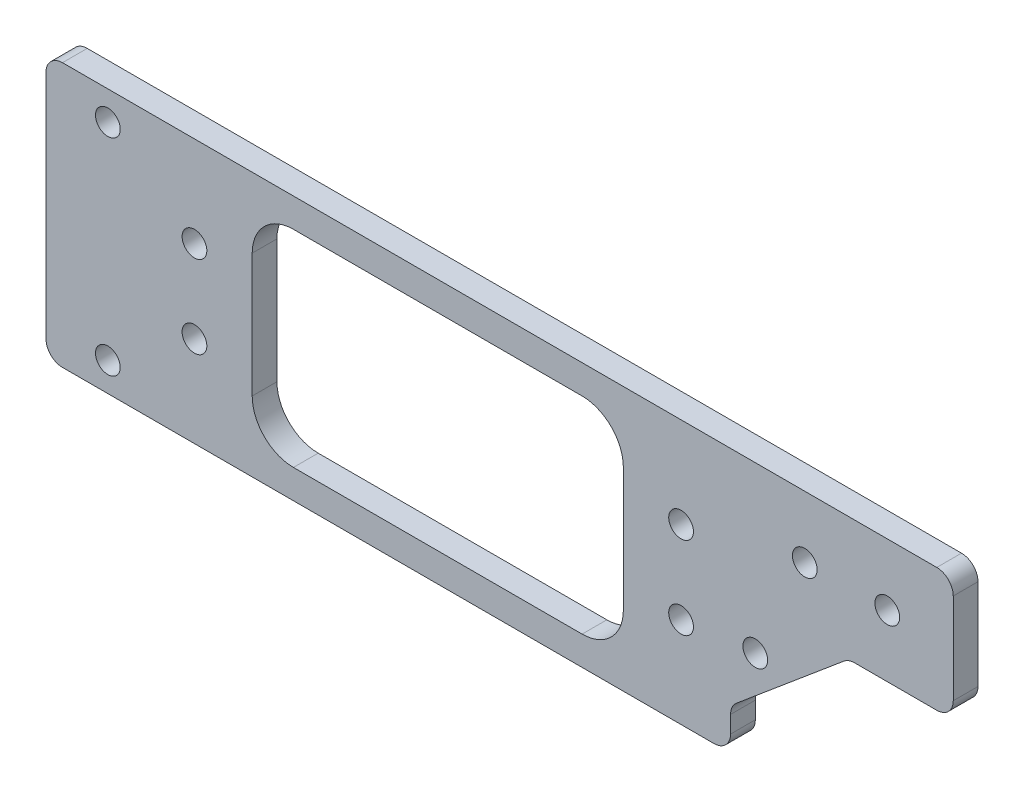
ISO-10303-21;
HEADER;
FILE_DESCRIPTION(('STEP AP214'),'2;1');
FILE_NAME('part.step','',(''),(''),'','','');
FILE_SCHEMA(('AUTOMOTIVE_DESIGN { 1 0 10303 214 1 1 1 1 }'));
ENDSEC;
DATA;
#1=APPLICATION_CONTEXT('core data for automotive mechanical design processes');
#2=APPLICATION_PROTOCOL_DEFINITION('international standard','automotive_design',2000,#1);
#3=PRODUCT_CONTEXT('',#1,'mechanical');
#4=PRODUCT('Part','Part','',(#3));
#5=PRODUCT_RELATED_PRODUCT_CATEGORY('part','',(#4));
#6=PRODUCT_DEFINITION_FORMATION('','',#4);
#7=PRODUCT_DEFINITION_CONTEXT('part definition',#1,'design');
#8=PRODUCT_DEFINITION('design','',#6,#7);
#9=PRODUCT_DEFINITION_SHAPE('','',#8);
#10=(LENGTH_UNIT() NAMED_UNIT(*) SI_UNIT(.MILLI.,.METRE.));
#11=(NAMED_UNIT(*) PLANE_ANGLE_UNIT() SI_UNIT($,.RADIAN.));
#12=(NAMED_UNIT(*) SI_UNIT($,.STERADIAN.) SOLID_ANGLE_UNIT());
#13=UNCERTAINTY_MEASURE_WITH_UNIT(LENGTH_MEASURE(1.E-05),#10,'distance_accuracy_value','');
#14=(GEOMETRIC_REPRESENTATION_CONTEXT(3) GLOBAL_UNCERTAINTY_ASSIGNED_CONTEXT((#13)) GLOBAL_UNIT_ASSIGNED_CONTEXT((#10,
#11,#12)) REPRESENTATION_CONTEXT('',''));
#15=CARTESIAN_POINT('',(0.,0.,0.));
#16=DIRECTION('',(0.,0.,1.));
#17=DIRECTION('',(1.,0.,0.));
#18=AXIS2_PLACEMENT_3D('',#15,#16,#17);
#19=CARTESIAN_POINT('',(0.,0.,3.));
#20=DIRECTION('',(0.,0.,-1.));
#21=DIRECTION('',(-1.,0.,0.));
#22=AXIS2_PLACEMENT_3D('',#19,#20,#21);
#23=PLANE('',#22);
#24=DIRECTION('',(1.,0.,0.));
#25=VECTOR('',#24,1.);
#26=CARTESIAN_POINT('',(35.5,-16.,3.));
#27=LINE('',#26,#25);
#28=CARTESIAN_POINT('',(-45.5,-16.,3.));
#29=VERTEX_POINT('',#28);
#30=CARTESIAN_POINT('',(33.5,-16.,3.));
#31=VERTEX_POINT('',#30);
#32=EDGE_CURVE('E353',#29,#31,#27,.T.);
#33=ORIENTED_EDGE('',*,*,#32,.T.);
#34=CARTESIAN_POINT('',(33.5,-14.,3.));
#35=DIRECTION('',(0.,0.,-1.));
#36=DIRECTION('',(-1.,0.,0.));
#37=AXIS2_PLACEMENT_3D('',#34,#35,#36);
#38=CIRCLE('',#37,2.);
#39=CARTESIAN_POINT('',(35.5,-14.,3.));
#40=VERTEX_POINT('',#39);
#41=EDGE_CURVE('E261',#31,#40,#38,.F.);
#42=ORIENTED_EDGE('',*,*,#41,.T.);
#43=DIRECTION('',(0.,1.,0.));
#44=VECTOR('',#43,1.);
#45=CARTESIAN_POINT('',(35.5,-11.,3.));
#46=LINE('',#45,#44);
#47=CARTESIAN_POINT('',(35.5,-11.93261531631,3.));
#48=VERTEX_POINT('',#47);
#49=EDGE_CURVE('E356',#40,#48,#46,.T.);
#50=ORIENTED_EDGE('',*,*,#49,.T.);
#51=CARTESIAN_POINT('',(37.5,-11.93261531631,3.));
#52=DIRECTION('',(0.,0.,-1.));
#53=DIRECTION('',(-1.,0.,0.));
#54=AXIS2_PLACEMENT_3D('',#51,#52,#53);
#55=CIRCLE('',#54,2.);
#56=CARTESIAN_POINT('',(36.2144247806269,-10.400526430072,3.));
#57=VERTEX_POINT('',#56);
#58=EDGE_CURVE('E194',#48,#57,#55,.T.);
#59=ORIENTED_EDGE('',*,*,#58,.T.);
#60=DIRECTION('',(0.766044443118975,0.642787609686543,0.));
#61=VECTOR('',#60,1.);
#62=CARTESIAN_POINT('',(35.5,-11.,3.));
#63=LINE('',#62,#61);
#64=CARTESIAN_POINT('',(49.2434083602897,0.532088886237948,3.));
#65=VERTEX_POINT('',#64);
#66=EDGE_CURVE('E204',#57,#65,#63,.T.);
#67=ORIENTED_EDGE('',*,*,#66,.T.);
#68=CARTESIAN_POINT('',(50.5289835796628,-1.,3.));
#69=DIRECTION('',(0.,0.,-1.));
#70=DIRECTION('',(-1.,0.,0.));
#71=AXIS2_PLACEMENT_3D('',#68,#69,#70);
#72=CIRCLE('',#71,2.);
#73=CARTESIAN_POINT('',(50.5289835796628,0.999999999999999,3.));
#74=VERTEX_POINT('',#73);
#75=EDGE_CURVE('E279',#65,#74,#72,.T.);
#76=ORIENTED_EDGE('',*,*,#75,.T.);
#77=DIRECTION('',(1.,0.,0.));
#78=VECTOR('',#77,1.);
#79=CARTESIAN_POINT('',(62.5,1.,3.));
#80=LINE('',#79,#78);
#81=CARTESIAN_POINT('',(60.5,1.,3.));
#82=VERTEX_POINT('',#81);
#83=EDGE_CURVE('E360',#74,#82,#80,.T.);
#84=ORIENTED_EDGE('',*,*,#83,.T.);
#85=CARTESIAN_POINT('',(60.5,3.,3.));
#86=DIRECTION('',(0.,0.,-1.));
#87=DIRECTION('',(-1.,0.,0.));
#88=AXIS2_PLACEMENT_3D('',#85,#86,#87);
#89=CIRCLE('',#88,2.);
#90=CARTESIAN_POINT('',(62.5,3.,3.));
#91=VERTEX_POINT('',#90);
#92=EDGE_CURVE('E259',#82,#91,#89,.F.);
#93=ORIENTED_EDGE('',*,*,#92,.T.);
#94=DIRECTION('',(0.,1.,0.));
#95=VECTOR('',#94,1.);
#96=CARTESIAN_POINT('',(62.5,16.,3.));
#97=LINE('',#96,#95);
#98=CARTESIAN_POINT('',(62.5,14.,3.));
#99=VERTEX_POINT('',#98);
#100=EDGE_CURVE('E228',#91,#99,#97,.T.);
#101=ORIENTED_EDGE('',*,*,#100,.T.);
#102=CARTESIAN_POINT('',(60.5,14.,3.));
#103=DIRECTION('',(0.,0.,-1.));
#104=DIRECTION('',(-1.,0.,0.));
#105=AXIS2_PLACEMENT_3D('',#102,#103,#104);
#106=CIRCLE('',#105,2.);
#107=CARTESIAN_POINT('',(60.5,16.,3.));
#108=VERTEX_POINT('',#107);
#109=EDGE_CURVE('E257',#99,#108,#106,.F.);
#110=ORIENTED_EDGE('',*,*,#109,.T.);
#111=DIRECTION('',(-1.,0.,0.));
#112=VECTOR('',#111,1.);
#113=CARTESIAN_POINT('',(-47.5,16.,3.));
#114=LINE('',#113,#112);
#115=CARTESIAN_POINT('',(-45.5,16.,3.));
#116=VERTEX_POINT('',#115);
#117=EDGE_CURVE('E227',#108,#116,#114,.T.);
#118=ORIENTED_EDGE('',*,*,#117,.T.);
#119=CARTESIAN_POINT('',(-45.5,14.,3.));
#120=DIRECTION('',(0.,0.,-1.));
#121=DIRECTION('',(-1.,0.,0.));
#122=AXIS2_PLACEMENT_3D('',#119,#120,#121);
#123=CIRCLE('',#122,2.);
#124=CARTESIAN_POINT('',(-47.5,14.,3.));
#125=VERTEX_POINT('',#124);
#126=EDGE_CURVE('E253',#116,#125,#123,.F.);
#127=ORIENTED_EDGE('',*,*,#126,.T.);
#128=DIRECTION('',(0.,-1.,0.));
#129=VECTOR('',#128,1.);
#130=CARTESIAN_POINT('',(-47.5,16.,3.));
#131=LINE('',#130,#129);
#132=CARTESIAN_POINT('',(-47.5,-14.,3.));
#133=VERTEX_POINT('',#132);
#134=EDGE_CURVE('E350',#125,#133,#131,.T.);
#135=ORIENTED_EDGE('',*,*,#134,.T.);
#136=CARTESIAN_POINT('',(-45.5,-14.,3.));
#137=DIRECTION('',(0.,0.,-1.));
#138=DIRECTION('',(-1.,0.,0.));
#139=AXIS2_PLACEMENT_3D('',#136,#137,#138);
#140=CIRCLE('',#139,2.);
#141=EDGE_CURVE('E255',#133,#29,#140,.F.);
#142=ORIENTED_EDGE('',*,*,#141,.T.);
#143=EDGE_LOOP('',(#33,#42,#50,#59,#67,#76,#84,#93,#101,#110,#118,#127,#135,#142));
#144=FACE_BOUND('',#143,.T.);
#145=DIRECTION('',(0.,1.,0.));
#146=VECTOR('',#145,1.);
#147=CARTESIAN_POINT('',(22.5,-12.5,3.));
#148=LINE('',#147,#146);
#149=CARTESIAN_POINT('',(22.5,-7.5,3.));
#150=VERTEX_POINT('',#149);
#151=CARTESIAN_POINT('',(22.5,7.5,3.));
#152=VERTEX_POINT('',#151);
#153=EDGE_CURVE('E330',#150,#152,#148,.T.);
#154=ORIENTED_EDGE('',*,*,#153,.F.);
#155=CARTESIAN_POINT('',(17.5,-7.5,3.));
#156=DIRECTION('',(0.,0.,-1.));
#157=DIRECTION('',(-1.,0.,0.));
#158=AXIS2_PLACEMENT_3D('',#155,#156,#157);
#159=CIRCLE('',#158,5.);
#160=CARTESIAN_POINT('',(17.5,-12.5,3.));
#161=VERTEX_POINT('',#160);
#162=EDGE_CURVE('E306',#150,#161,#159,.T.);
#163=ORIENTED_EDGE('',*,*,#162,.T.);
#164=DIRECTION('',(1.,0.,0.));
#165=VECTOR('',#164,1.);
#166=CARTESIAN_POINT('',(-22.5,-12.5,3.));
#167=LINE('',#166,#165);
#168=CARTESIAN_POINT('',(-17.5,-12.5,3.));
#169=VERTEX_POINT('',#168);
#170=EDGE_CURVE('E332',#169,#161,#167,.T.);
#171=ORIENTED_EDGE('',*,*,#170,.F.);
#172=CARTESIAN_POINT('',(-17.5,-7.5,3.));
#173=DIRECTION('',(0.,0.,-1.));
#174=DIRECTION('',(-1.,0.,0.));
#175=AXIS2_PLACEMENT_3D('',#172,#173,#174);
#176=CIRCLE('',#175,5.);
#177=CARTESIAN_POINT('',(-22.5,-7.5,3.));
#178=VERTEX_POINT('',#177);
#179=EDGE_CURVE('E302',#169,#178,#176,.T.);
#180=ORIENTED_EDGE('',*,*,#179,.T.);
#181=DIRECTION('',(0.,-1.,0.));
#182=VECTOR('',#181,1.);
#183=CARTESIAN_POINT('',(-22.5,-12.5,3.));
#184=LINE('',#183,#182);
#185=CARTESIAN_POINT('',(-22.5,7.5,3.));
#186=VERTEX_POINT('',#185);
#187=EDGE_CURVE('E329',#186,#178,#184,.T.);
#188=ORIENTED_EDGE('',*,*,#187,.F.);
#189=CARTESIAN_POINT('',(-17.5,7.5,3.));
#190=DIRECTION('',(0.,0.,-1.));
#191=DIRECTION('',(-1.,0.,0.));
#192=AXIS2_PLACEMENT_3D('',#189,#190,#191);
#193=CIRCLE('',#192,5.);
#194=CARTESIAN_POINT('',(-17.5,12.5,3.));
#195=VERTEX_POINT('',#194);
#196=EDGE_CURVE('E11',#186,#195,#193,.T.);
#197=ORIENTED_EDGE('',*,*,#196,.T.);
#198=DIRECTION('',(-1.,0.,0.));
#199=VECTOR('',#198,1.);
#200=CARTESIAN_POINT('',(-22.5,12.5,3.));
#201=LINE('',#200,#199);
#202=CARTESIAN_POINT('',(17.5,12.5,3.));
#203=VERTEX_POINT('',#202);
#204=EDGE_CURVE('E327',#203,#195,#201,.T.);
#205=ORIENTED_EDGE('',*,*,#204,.F.);
#206=CARTESIAN_POINT('',(17.5,7.5,3.));
#207=DIRECTION('',(0.,0.,-1.));
#208=DIRECTION('',(-1.,0.,0.));
#209=AXIS2_PLACEMENT_3D('',#206,#207,#208);
#210=CIRCLE('',#209,5.);
#211=EDGE_CURVE('E310',#203,#152,#210,.T.);
#212=ORIENTED_EDGE('',*,*,#211,.T.);
#213=EDGE_LOOP('',(#154,#163,#171,#180,#188,#197,#205,#212));
#214=FACE_BOUND('',#213,.T.);
#215=CARTESIAN_POINT('',(-29.5,5.,3.));
#216=DIRECTION('',(0.,0.,1.));
#217=DIRECTION('',(1.,0.,0.));
#218=AXIS2_PLACEMENT_3D('',#215,#216,#217);
#219=CIRCLE('',#218,1.5);
#220=CARTESIAN_POINT('',(-28.,5.,3.));
#221=VERTEX_POINT('',#220);
#222=EDGE_CURVE('E344',#221,#221,#219,.T.);
#223=ORIENTED_EDGE('',*,*,#222,.F.);
#224=EDGE_LOOP('',(#223));
#225=FACE_BOUND('',#224,.T.);
#226=CARTESIAN_POINT('',(-29.5,-5.,3.));
#227=DIRECTION('',(0.,0.,1.));
#228=DIRECTION('',(1.,0.,0.));
#229=AXIS2_PLACEMENT_3D('',#226,#227,#228);
#230=CIRCLE('',#229,1.5);
#231=CARTESIAN_POINT('',(-28.,-5.,3.));
#232=VERTEX_POINT('',#231);
#233=EDGE_CURVE('E712',#232,#232,#230,.T.);
#234=ORIENTED_EDGE('',*,*,#233,.F.);
#235=EDGE_LOOP('',(#234));
#236=FACE_BOUND('',#235,.T.);
#237=CARTESIAN_POINT('',(29.5,5.,3.));
#238=DIRECTION('',(0.,0.,1.));
#239=DIRECTION('',(1.,0.,0.));
#240=AXIS2_PLACEMENT_3D('',#237,#238,#239);
#241=CIRCLE('',#240,1.5);
#242=CARTESIAN_POINT('',(31.,5.,3.));
#243=VERTEX_POINT('',#242);
#244=EDGE_CURVE('E717',#243,#243,#241,.T.);
#245=ORIENTED_EDGE('',*,*,#244,.F.);
#246=EDGE_LOOP('',(#245));
#247=FACE_BOUND('',#246,.T.);
#248=CARTESIAN_POINT('',(29.5,-5.,3.));
#249=DIRECTION('',(0.,0.,1.));
#250=DIRECTION('',(1.,0.,0.));
#251=AXIS2_PLACEMENT_3D('',#248,#249,#250);
#252=CIRCLE('',#251,1.5);
#253=CARTESIAN_POINT('',(31.,-5.,3.));
#254=VERTEX_POINT('',#253);
#255=EDGE_CURVE('E772',#254,#254,#252,.T.);
#256=ORIENTED_EDGE('',*,*,#255,.F.);
#257=EDGE_LOOP('',(#256));
#258=FACE_BOUND('',#257,.T.);
#259=CARTESIAN_POINT('',(44.5,8.5,3.));
#260=DIRECTION('',(0.,0.,1.));
#261=DIRECTION('',(1.,0.,0.));
#262=AXIS2_PLACEMENT_3D('',#259,#260,#261);
#263=CIRCLE('',#262,1.5);
#264=CARTESIAN_POINT('',(46.,8.5,3.));
#265=VERTEX_POINT('',#264);
#266=EDGE_CURVE('E767',#265,#265,#263,.T.);
#267=ORIENTED_EDGE('',*,*,#266,.F.);
#268=EDGE_LOOP('',(#267));
#269=FACE_BOUND('',#268,.T.);
#270=CARTESIAN_POINT('',(54.5,8.5,3.));
#271=DIRECTION('',(0.,0.,1.));
#272=DIRECTION('',(1.,0.,0.));
#273=AXIS2_PLACEMENT_3D('',#270,#271,#272);
#274=CIRCLE('',#273,1.5);
#275=CARTESIAN_POINT('',(56.,8.5,3.));
#276=VERTEX_POINT('',#275);
#277=EDGE_CURVE('E762',#276,#276,#274,.T.);
#278=ORIENTED_EDGE('',*,*,#277,.F.);
#279=EDGE_LOOP('',(#278));
#280=FACE_BOUND('',#279,.T.);
#281=CARTESIAN_POINT('',(-40.,12.5,3.));
#282=DIRECTION('',(0.,0.,1.));
#283=DIRECTION('',(1.,0.,0.));
#284=AXIS2_PLACEMENT_3D('',#281,#282,#283);
#285=CIRCLE('',#284,1.5);
#286=CARTESIAN_POINT('',(-38.5,12.5,3.));
#287=VERTEX_POINT('',#286);
#288=EDGE_CURVE('E757',#287,#287,#285,.T.);
#289=ORIENTED_EDGE('',*,*,#288,.F.);
#290=EDGE_LOOP('',(#289));
#291=FACE_BOUND('',#290,.T.);
#292=CARTESIAN_POINT('',(-40.,-12.5,3.));
#293=DIRECTION('',(0.,0.,1.));
#294=DIRECTION('',(-1.,0.,0.));
#295=AXIS2_PLACEMENT_3D('',#292,#293,#294);
#296=CIRCLE('',#295,1.5);
#297=CARTESIAN_POINT('',(-41.5,-12.5,3.));
#298=VERTEX_POINT('',#297);
#299=EDGE_CURVE('E752',#298,#298,#296,.T.);
#300=ORIENTED_EDGE('',*,*,#299,.F.);
#301=EDGE_LOOP('',(#300));
#302=FACE_BOUND('',#301,.T.);
#303=CARTESIAN_POINT('',(38.5,-4.,3.));
#304=DIRECTION('',(0.,0.,1.));
#305=DIRECTION('',(1.,0.,0.));
#306=AXIS2_PLACEMENT_3D('',#303,#304,#305);
#307=CIRCLE('',#306,1.5);
#308=CARTESIAN_POINT('',(40.,-4.,3.));
#309=VERTEX_POINT('',#308);
#310=EDGE_CURVE('E746',#309,#309,#307,.T.);
#311=ORIENTED_EDGE('',*,*,#310,.F.);
#312=EDGE_LOOP('',(#311));
#313=FACE_BOUND('',#312,.T.);
#314=ADVANCED_FACE('F35',(#144,#214,#225,#236,#247,#258,#269,#280,#291,#302,#313),#23,.F.);
#315=CARTESIAN_POINT('',(0.,0.,0.));
#316=DIRECTION('',(0.,0.,-1.));
#317=DIRECTION('',(-1.,0.,0.));
#318=AXIS2_PLACEMENT_3D('',#315,#316,#317);
#319=PLANE('',#318);
#320=CARTESIAN_POINT('',(-40.,-12.5,0.));
#321=DIRECTION('',(0.,0.,1.));
#322=DIRECTION('',(-1.,0.,0.));
#323=AXIS2_PLACEMENT_3D('',#320,#321,#322);
#324=CIRCLE('',#323,1.5);
#325=CARTESIAN_POINT('',(-41.5,-12.5,0.));
#326=VERTEX_POINT('',#325);
#327=EDGE_CURVE('E749',#326,#326,#324,.T.);
#328=ORIENTED_EDGE('',*,*,#327,.T.);
#329=EDGE_LOOP('',(#328));
#330=FACE_BOUND('',#329,.T.);
#331=CARTESIAN_POINT('',(54.5,8.5,0.));
#332=DIRECTION('',(0.,0.,1.));
#333=DIRECTION('',(1.,0.,0.));
#334=AXIS2_PLACEMENT_3D('',#331,#332,#333);
#335=CIRCLE('',#334,1.5);
#336=CARTESIAN_POINT('',(56.,8.5,0.));
#337=VERTEX_POINT('',#336);
#338=EDGE_CURVE('E760',#337,#337,#335,.T.);
#339=ORIENTED_EDGE('',*,*,#338,.T.);
#340=EDGE_LOOP('',(#339));
#341=FACE_BOUND('',#340,.T.);
#342=CARTESIAN_POINT('',(29.5,-5.,0.));
#343=DIRECTION('',(0.,0.,1.));
#344=DIRECTION('',(1.,0.,0.));
#345=AXIS2_PLACEMENT_3D('',#342,#343,#344);
#346=CIRCLE('',#345,1.5);
#347=CARTESIAN_POINT('',(31.,-5.,0.));
#348=VERTEX_POINT('',#347);
#349=EDGE_CURVE('E770',#348,#348,#346,.T.);
#350=ORIENTED_EDGE('',*,*,#349,.T.);
#351=EDGE_LOOP('',(#350));
#352=FACE_BOUND('',#351,.T.);
#353=CARTESIAN_POINT('',(-29.5,-5.,0.));
#354=DIRECTION('',(0.,0.,1.));
#355=DIRECTION('',(1.,0.,0.));
#356=AXIS2_PLACEMENT_3D('',#353,#354,#355);
#357=CIRCLE('',#356,1.5);
#358=CARTESIAN_POINT('',(-28.,-5.,0.));
#359=VERTEX_POINT('',#358);
#360=EDGE_CURVE('E715',#359,#359,#357,.T.);
#361=ORIENTED_EDGE('',*,*,#360,.T.);
#362=EDGE_LOOP('',(#361));
#363=FACE_BOUND('',#362,.T.);
#364=DIRECTION('',(0.,-1.,0.));
#365=VECTOR('',#364,1.);
#366=CARTESIAN_POINT('',(-22.5,-12.5,0.));
#367=LINE('',#366,#365);
#368=CARTESIAN_POINT('',(-22.5,7.5,0.));
#369=VERTEX_POINT('',#368);
#370=CARTESIAN_POINT('',(-22.5,-7.5,0.));
#371=VERTEX_POINT('',#370);
#372=EDGE_CURVE('E315',#369,#371,#367,.T.);
#373=ORIENTED_EDGE('',*,*,#372,.T.);
#374=CARTESIAN_POINT('',(-17.5,-7.5,0.));
#375=DIRECTION('',(0.,0.,-1.));
#376=DIRECTION('',(-1.,0.,0.));
#377=AXIS2_PLACEMENT_3D('',#374,#375,#376);
#378=CIRCLE('',#377,5.);
#379=CARTESIAN_POINT('',(-17.5,-12.5,0.));
#380=VERTEX_POINT('',#379);
#381=EDGE_CURVE('E300',#371,#380,#378,.F.);
#382=ORIENTED_EDGE('',*,*,#381,.T.);
#383=DIRECTION('',(1.,0.,0.));
#384=VECTOR('',#383,1.);
#385=CARTESIAN_POINT('',(-22.5,-12.5,0.));
#386=LINE('',#385,#384);
#387=CARTESIAN_POINT('',(17.5,-12.5,0.));
#388=VERTEX_POINT('',#387);
#389=EDGE_CURVE('E324',#380,#388,#386,.T.);
#390=ORIENTED_EDGE('',*,*,#389,.T.);
#391=CARTESIAN_POINT('',(17.5,-7.5,0.));
#392=DIRECTION('',(0.,0.,-1.));
#393=DIRECTION('',(-1.,0.,0.));
#394=AXIS2_PLACEMENT_3D('',#391,#392,#393);
#395=CIRCLE('',#394,5.);
#396=CARTESIAN_POINT('',(22.5,-7.5,0.));
#397=VERTEX_POINT('',#396);
#398=EDGE_CURVE('E304',#388,#397,#395,.F.);
#399=ORIENTED_EDGE('',*,*,#398,.T.);
#400=DIRECTION('',(0.,1.,0.));
#401=VECTOR('',#400,1.);
#402=CARTESIAN_POINT('',(22.5,-12.5,0.));
#403=LINE('',#402,#401);
#404=CARTESIAN_POINT('',(22.5,7.5,0.));
#405=VERTEX_POINT('',#404);
#406=EDGE_CURVE('E341',#397,#405,#403,.T.);
#407=ORIENTED_EDGE('',*,*,#406,.T.);
#408=CARTESIAN_POINT('',(17.5,7.5,0.));
#409=DIRECTION('',(0.,0.,-1.));
#410=DIRECTION('',(-1.,0.,0.));
#411=AXIS2_PLACEMENT_3D('',#408,#409,#410);
#412=CIRCLE('',#411,5.);
#413=CARTESIAN_POINT('',(17.5,12.5,0.));
#414=VERTEX_POINT('',#413);
#415=EDGE_CURVE('E308',#405,#414,#412,.F.);
#416=ORIENTED_EDGE('',*,*,#415,.T.);
#417=DIRECTION('',(-1.,0.,0.));
#418=VECTOR('',#417,1.);
#419=CARTESIAN_POINT('',(-22.5,12.5,0.));
#420=LINE('',#419,#418);
#421=CARTESIAN_POINT('',(-17.5,12.5,0.));
#422=VERTEX_POINT('',#421);
#423=EDGE_CURVE('E316',#414,#422,#420,.T.);
#424=ORIENTED_EDGE('',*,*,#423,.T.);
#425=CARTESIAN_POINT('',(-17.5,7.5,0.));
#426=DIRECTION('',(0.,0.,-1.));
#427=DIRECTION('',(-1.,0.,0.));
#428=AXIS2_PLACEMENT_3D('',#425,#426,#427);
#429=CIRCLE('',#428,5.);
#430=EDGE_CURVE('E43',#422,#369,#429,.F.);
#431=ORIENTED_EDGE('',*,*,#430,.T.);
#432=EDGE_LOOP('',(#373,#382,#390,#399,#407,#416,#424,#431));
#433=FACE_BOUND('',#432,.T.);
#434=DIRECTION('',(0.,1.,0.));
#435=VECTOR('',#434,1.);
#436=CARTESIAN_POINT('',(35.5,-11.,0.));
#437=LINE('',#436,#435);
#438=CARTESIAN_POINT('',(35.5,-14.,0.));
#439=VERTEX_POINT('',#438);
#440=CARTESIAN_POINT('',(35.5,-11.93261531631,0.));
#441=VERTEX_POINT('',#440);
#442=EDGE_CURVE('E213',#439,#441,#437,.T.);
#443=ORIENTED_EDGE('',*,*,#442,.F.);
#444=CARTESIAN_POINT('',(33.5,-14.,0.));
#445=DIRECTION('',(0.,0.,-1.));
#446=DIRECTION('',(-1.,0.,0.));
#447=AXIS2_PLACEMENT_3D('',#444,#445,#446);
#448=CIRCLE('',#447,2.);
#449=CARTESIAN_POINT('',(33.5,-16.,0.));
#450=VERTEX_POINT('',#449);
#451=EDGE_CURVE('E246',#439,#450,#448,.T.);
#452=ORIENTED_EDGE('',*,*,#451,.T.);
#453=DIRECTION('',(1.,0.,0.));
#454=VECTOR('',#453,1.);
#455=CARTESIAN_POINT('',(35.5,-16.,0.));
#456=LINE('',#455,#454);
#457=CARTESIAN_POINT('',(-45.5,-16.,0.));
#458=VERTEX_POINT('',#457);
#459=EDGE_CURVE('E218',#458,#450,#456,.T.);
#460=ORIENTED_EDGE('',*,*,#459,.F.);
#461=CARTESIAN_POINT('',(-45.5,-14.,0.));
#462=DIRECTION('',(0.,0.,-1.));
#463=DIRECTION('',(-1.,0.,0.));
#464=AXIS2_PLACEMENT_3D('',#461,#462,#463);
#465=CIRCLE('',#464,2.);
#466=CARTESIAN_POINT('',(-47.5,-14.,0.));
#467=VERTEX_POINT('',#466);
#468=EDGE_CURVE('E240',#458,#467,#465,.T.);
#469=ORIENTED_EDGE('',*,*,#468,.T.);
#470=DIRECTION('',(0.,-1.,0.));
#471=VECTOR('',#470,1.);
#472=CARTESIAN_POINT('',(-47.5,16.,0.));
#473=LINE('',#472,#471);
#474=CARTESIAN_POINT('',(-47.5,14.,0.));
#475=VERTEX_POINT('',#474);
#476=EDGE_CURVE('E340',#475,#467,#473,.T.);
#477=ORIENTED_EDGE('',*,*,#476,.F.);
#478=CARTESIAN_POINT('',(-45.5,14.,0.));
#479=DIRECTION('',(0.,0.,-1.));
#480=DIRECTION('',(-1.,0.,0.));
#481=AXIS2_PLACEMENT_3D('',#478,#479,#480);
#482=CIRCLE('',#481,2.);
#483=CARTESIAN_POINT('',(-45.5,16.,0.));
#484=VERTEX_POINT('',#483);
#485=EDGE_CURVE('E238',#475,#484,#482,.T.);
#486=ORIENTED_EDGE('',*,*,#485,.T.);
#487=DIRECTION('',(-1.,0.,0.));
#488=VECTOR('',#487,1.);
#489=CARTESIAN_POINT('',(35.5,16.,0.));
#490=LINE('',#489,#488);
#491=CARTESIAN_POINT('',(60.5,16.,0.));
#492=VERTEX_POINT('',#491);
#493=EDGE_CURVE('E224',#492,#484,#490,.T.);
#494=ORIENTED_EDGE('',*,*,#493,.F.);
#495=CARTESIAN_POINT('',(60.5,14.,0.));
#496=DIRECTION('',(0.,0.,-1.));
#497=DIRECTION('',(-1.,0.,0.));
#498=AXIS2_PLACEMENT_3D('',#495,#496,#497);
#499=CIRCLE('',#498,2.);
#500=CARTESIAN_POINT('',(62.5,14.,0.));
#501=VERTEX_POINT('',#500);
#502=EDGE_CURVE('E242',#492,#501,#499,.T.);
#503=ORIENTED_EDGE('',*,*,#502,.T.);
#504=DIRECTION('',(0.,1.,0.));
#505=VECTOR('',#504,1.);
#506=CARTESIAN_POINT('',(62.5,16.,0.));
#507=LINE('',#506,#505);
#508=CARTESIAN_POINT('',(62.5,3.,0.));
#509=VERTEX_POINT('',#508);
#510=EDGE_CURVE('E216',#509,#501,#507,.T.);
#511=ORIENTED_EDGE('',*,*,#510,.F.);
#512=CARTESIAN_POINT('',(60.5,3.,0.));
#513=DIRECTION('',(0.,0.,-1.));
#514=DIRECTION('',(-1.,0.,0.));
#515=AXIS2_PLACEMENT_3D('',#512,#513,#514);
#516=CIRCLE('',#515,2.);
#517=CARTESIAN_POINT('',(60.5,1.,0.));
#518=VERTEX_POINT('',#517);
#519=EDGE_CURVE('E244',#509,#518,#516,.T.);
#520=ORIENTED_EDGE('',*,*,#519,.T.);
#521=DIRECTION('',(1.,0.,0.));
#522=VECTOR('',#521,1.);
#523=CARTESIAN_POINT('',(62.5,1.,0.));
#524=LINE('',#523,#522);
#525=CARTESIAN_POINT('',(50.5289835796628,0.999999999999999,0.));
#526=VERTEX_POINT('',#525);
#527=EDGE_CURVE('E212',#526,#518,#524,.T.);
#528=ORIENTED_EDGE('',*,*,#527,.F.);
#529=CARTESIAN_POINT('',(50.5289835796628,-1.,0.));
#530=DIRECTION('',(0.,0.,-1.));
#531=DIRECTION('',(-1.,0.,0.));
#532=AXIS2_PLACEMENT_3D('',#529,#530,#531);
#533=CIRCLE('',#532,2.);
#534=CARTESIAN_POINT('',(49.2434083602897,0.532088886237948,0.));
#535=VERTEX_POINT('',#534);
#536=EDGE_CURVE('E211',#526,#535,#533,.F.);
#537=ORIENTED_EDGE('',*,*,#536,.T.);
#538=DIRECTION('',(0.766044443118975,0.642787609686543,0.));
#539=VECTOR('',#538,1.);
#540=CARTESIAN_POINT('',(35.5,-11.,0.));
#541=LINE('',#540,#539);
#542=CARTESIAN_POINT('',(36.2144247806269,-10.400526430072,0.));
#543=VERTEX_POINT('',#542);
#544=EDGE_CURVE('E201',#543,#535,#541,.T.);
#545=ORIENTED_EDGE('',*,*,#544,.F.);
#546=CARTESIAN_POINT('',(37.5,-11.93261531631,0.));
#547=DIRECTION('',(0.,0.,-1.));
#548=DIRECTION('',(-1.,0.,0.));
#549=AXIS2_PLACEMENT_3D('',#546,#547,#548);
#550=CIRCLE('',#549,2.);
#551=EDGE_CURVE('E184',#543,#441,#550,.F.);
#552=ORIENTED_EDGE('',*,*,#551,.T.);
#553=EDGE_LOOP('',(#443,#452,#460,#469,#477,#486,#494,#503,#511,#520,#528,#537,#545,#552));
#554=FACE_BOUND('',#553,.T.);
#555=CARTESIAN_POINT('',(-29.5,5.,0.));
#556=DIRECTION('',(0.,0.,1.));
#557=DIRECTION('',(1.,0.,0.));
#558=AXIS2_PLACEMENT_3D('',#555,#556,#557);
#559=CIRCLE('',#558,1.5);
#560=CARTESIAN_POINT('',(-28.,5.,0.));
#561=VERTEX_POINT('',#560);
#562=EDGE_CURVE('E719',#561,#561,#559,.T.);
#563=ORIENTED_EDGE('',*,*,#562,.T.);
#564=EDGE_LOOP('',(#563));
#565=FACE_BOUND('',#564,.T.);
#566=CARTESIAN_POINT('',(29.5,5.,0.));
#567=DIRECTION('',(0.,0.,1.));
#568=DIRECTION('',(1.,0.,0.));
#569=AXIS2_PLACEMENT_3D('',#566,#567,#568);
#570=CIRCLE('',#569,1.5);
#571=CARTESIAN_POINT('',(31.,5.,0.));
#572=VERTEX_POINT('',#571);
#573=EDGE_CURVE('E722',#572,#572,#570,.T.);
#574=ORIENTED_EDGE('',*,*,#573,.T.);
#575=EDGE_LOOP('',(#574));
#576=FACE_BOUND('',#575,.T.);
#577=CARTESIAN_POINT('',(44.5,8.5,0.));
#578=DIRECTION('',(0.,0.,1.));
#579=DIRECTION('',(1.,0.,0.));
#580=AXIS2_PLACEMENT_3D('',#577,#578,#579);
#581=CIRCLE('',#580,1.5);
#582=CARTESIAN_POINT('',(46.,8.5,0.));
#583=VERTEX_POINT('',#582);
#584=EDGE_CURVE('E737',#583,#583,#581,.T.);
#585=ORIENTED_EDGE('',*,*,#584,.T.);
#586=EDGE_LOOP('',(#585));
#587=FACE_BOUND('',#586,.T.);
#588=CARTESIAN_POINT('',(-40.,12.5,0.));
#589=DIRECTION('',(0.,0.,1.));
#590=DIRECTION('',(1.,0.,0.));
#591=AXIS2_PLACEMENT_3D('',#588,#589,#590);
#592=CIRCLE('',#591,1.5);
#593=CARTESIAN_POINT('',(-38.5,12.5,0.));
#594=VERTEX_POINT('',#593);
#595=EDGE_CURVE('E741',#594,#594,#592,.T.);
#596=ORIENTED_EDGE('',*,*,#595,.T.);
#597=EDGE_LOOP('',(#596));
#598=FACE_BOUND('',#597,.T.);
#599=CARTESIAN_POINT('',(38.5,-4.,0.));
#600=DIRECTION('',(0.,0.,1.));
#601=DIRECTION('',(1.,0.,0.));
#602=AXIS2_PLACEMENT_3D('',#599,#600,#601);
#603=CIRCLE('',#602,1.5);
#604=CARTESIAN_POINT('',(40.,-4.,0.));
#605=VERTEX_POINT('',#604);
#606=EDGE_CURVE('E744',#605,#605,#603,.T.);
#607=ORIENTED_EDGE('',*,*,#606,.T.);
#608=EDGE_LOOP('',(#607));
#609=FACE_BOUND('',#608,.T.);
#610=ADVANCED_FACE('F208',(#330,#341,#352,#363,#433,#554,#565,#576,#587,#598,#609),#319,.T.);
#611=CARTESIAN_POINT('',(-47.5,16.,3.));
#612=DIRECTION('',(1.,0.,0.));
#613=DIRECTION('',(0.,0.,-1.));
#614=AXIS2_PLACEMENT_3D('',#611,#612,#613);
#615=PLANE('',#614);
#616=ORIENTED_EDGE('',*,*,#476,.T.);
#617=DIRECTION('',(0.,0.,-1.));
#618=VECTOR('',#617,1.);
#619=CARTESIAN_POINT('',(-47.5,-14.,3.));
#620=LINE('',#619,#618);
#621=EDGE_CURVE('E195',#467,#133,#620,.F.);
#622=ORIENTED_EDGE('',*,*,#621,.T.);
#623=ORIENTED_EDGE('',*,*,#134,.F.);
#624=DIRECTION('',(0.,0.,-1.));
#625=VECTOR('',#624,1.);
#626=CARTESIAN_POINT('',(-47.5,14.,3.));
#627=LINE('',#626,#625);
#628=EDGE_CURVE('E273',#125,#475,#627,.T.);
#629=ORIENTED_EDGE('',*,*,#628,.T.);
#630=EDGE_LOOP('',(#616,#622,#623,#629));
#631=FACE_BOUND('',#630,.T.);
#632=ADVANCED_FACE('F389',(#631),#615,.F.);
#633=CARTESIAN_POINT('',(35.5,-16.,3.));
#634=DIRECTION('',(0.,1.,0.));
#635=DIRECTION('',(-1.,0.,0.));
#636=AXIS2_PLACEMENT_3D('',#633,#634,#635);
#637=PLANE('',#636);
#638=ORIENTED_EDGE('',*,*,#459,.T.);
#639=DIRECTION('',(0.,0.,-1.));
#640=VECTOR('',#639,1.);
#641=CARTESIAN_POINT('',(33.5,-16.,3.));
#642=LINE('',#641,#640);
#643=EDGE_CURVE('E251',#450,#31,#642,.F.);
#644=ORIENTED_EDGE('',*,*,#643,.T.);
#645=ORIENTED_EDGE('',*,*,#32,.F.);
#646=DIRECTION('',(0.,0.,-1.));
#647=VECTOR('',#646,1.);
#648=CARTESIAN_POINT('',(-45.5,-16.,3.));
#649=LINE('',#648,#647);
#650=EDGE_CURVE('E248',#29,#458,#649,.T.);
#651=ORIENTED_EDGE('',*,*,#650,.T.);
#652=EDGE_LOOP('',(#638,#644,#645,#651));
#653=FACE_BOUND('',#652,.T.);
#654=ADVANCED_FACE('F370',(#653),#637,.F.);
#655=CARTESIAN_POINT('',(35.5,-11.,3.));
#656=DIRECTION('',(-1.,0.,0.));
#657=DIRECTION('',(0.,0.,1.));
#658=AXIS2_PLACEMENT_3D('',#655,#656,#657);
#659=PLANE('',#658);
#660=ORIENTED_EDGE('',*,*,#442,.T.);
#661=DIRECTION('',(0.,0.,-1.));
#662=VECTOR('',#661,1.);
#663=CARTESIAN_POINT('',(35.5,-11.93261531631,3.));
#664=LINE('',#663,#662);
#665=EDGE_CURVE('E189',#441,#48,#664,.F.);
#666=ORIENTED_EDGE('',*,*,#665,.T.);
#667=ORIENTED_EDGE('',*,*,#49,.F.);
#668=DIRECTION('',(0.,0.,-1.));
#669=VECTOR('',#668,1.);
#670=CARTESIAN_POINT('',(35.5,-14.,3.));
#671=LINE('',#670,#669);
#672=EDGE_CURVE('E205',#40,#439,#671,.T.);
#673=ORIENTED_EDGE('',*,*,#672,.T.);
#674=EDGE_LOOP('',(#660,#666,#667,#673));
#675=FACE_BOUND('',#674,.T.);
#676=ADVANCED_FACE('F380',(#675),#659,.F.);
#677=CARTESIAN_POINT('',(35.5,-11.,3.));
#678=DIRECTION('',(-0.642787609686543,0.766044443118975,0.));
#679=DIRECTION('',(-0.766044443118975,-0.642787609686543,0.));
#680=AXIS2_PLACEMENT_3D('',#677,#678,#679);
#681=PLANE('',#680);
#682=ORIENTED_EDGE('',*,*,#66,.F.);
#683=DIRECTION('',(0.,0.,-1.));
#684=VECTOR('',#683,1.);
#685=CARTESIAN_POINT('',(36.2144247806269,-10.400526430072,0.));
#686=LINE('',#685,#684);
#687=EDGE_CURVE('E188',#57,#543,#686,.T.);
#688=ORIENTED_EDGE('',*,*,#687,.T.);
#689=ORIENTED_EDGE('',*,*,#544,.T.);
#690=DIRECTION('',(0.,0.,-1.));
#691=VECTOR('',#690,1.);
#692=CARTESIAN_POINT('',(49.2434083602897,0.532088886237949,3.));
#693=LINE('',#692,#691);
#694=EDGE_CURVE('E206',#535,#65,#693,.F.);
#695=ORIENTED_EDGE('',*,*,#694,.T.);
#696=EDGE_LOOP('',(#682,#688,#689,#695));
#697=FACE_BOUND('',#696,.T.);
#698=ADVANCED_FACE('F200',(#697),#681,.F.);
#699=CARTESIAN_POINT('',(62.5,1.,3.));
#700=DIRECTION('',(0.,1.,0.));
#701=DIRECTION('',(-1.,0.,0.));
#702=AXIS2_PLACEMENT_3D('',#699,#700,#701);
#703=PLANE('',#702);
#704=ORIENTED_EDGE('',*,*,#83,.F.);
#705=DIRECTION('',(0.,0.,-1.));
#706=VECTOR('',#705,1.);
#707=CARTESIAN_POINT('',(50.5289835796628,0.999999999999999,0.));
#708=LINE('',#707,#706);
#709=EDGE_CURVE('E235',#74,#526,#708,.T.);
#710=ORIENTED_EDGE('',*,*,#709,.T.);
#711=ORIENTED_EDGE('',*,*,#527,.T.);
#712=DIRECTION('',(0.,0.,-1.));
#713=VECTOR('',#712,1.);
#714=CARTESIAN_POINT('',(60.5,1.,3.));
#715=LINE('',#714,#713);
#716=EDGE_CURVE('E233',#518,#82,#715,.F.);
#717=ORIENTED_EDGE('',*,*,#716,.T.);
#718=EDGE_LOOP('',(#704,#710,#711,#717));
#719=FACE_BOUND('',#718,.T.);
#720=ADVANCED_FACE('F387',(#719),#703,.F.);
#721=CARTESIAN_POINT('',(62.5,16.,3.));
#722=DIRECTION('',(-1.,0.,0.));
#723=DIRECTION('',(0.,0.,1.));
#724=AXIS2_PLACEMENT_3D('',#721,#722,#723);
#725=PLANE('',#724);
#726=ORIENTED_EDGE('',*,*,#100,.F.);
#727=DIRECTION('',(0.,0.,-1.));
#728=VECTOR('',#727,1.);
#729=CARTESIAN_POINT('',(62.5,3.,3.));
#730=LINE('',#729,#728);
#731=EDGE_CURVE('E265',#91,#509,#730,.T.);
#732=ORIENTED_EDGE('',*,*,#731,.T.);
#733=ORIENTED_EDGE('',*,*,#510,.T.);
#734=DIRECTION('',(0.,0.,-1.));
#735=VECTOR('',#734,1.);
#736=CARTESIAN_POINT('',(62.5,14.,3.));
#737=LINE('',#736,#735);
#738=EDGE_CURVE('E263',#501,#99,#737,.F.);
#739=ORIENTED_EDGE('',*,*,#738,.T.);
#740=EDGE_LOOP('',(#726,#732,#733,#739));
#741=FACE_BOUND('',#740,.T.);
#742=ADVANCED_FACE('F405',(#741),#725,.F.);
#743=CARTESIAN_POINT('',(35.5,16.,3.));
#744=DIRECTION('',(0.,-1.,0.));
#745=DIRECTION('',(0.,0.,-1.));
#746=AXIS2_PLACEMENT_3D('',#743,#744,#745);
#747=PLANE('',#746);
#748=ORIENTED_EDGE('',*,*,#117,.F.);
#749=DIRECTION('',(0.,0.,-1.));
#750=VECTOR('',#749,1.);
#751=CARTESIAN_POINT('',(60.5,16.,3.));
#752=LINE('',#751,#750);
#753=EDGE_CURVE('E270',#108,#492,#752,.T.);
#754=ORIENTED_EDGE('',*,*,#753,.T.);
#755=ORIENTED_EDGE('',*,*,#493,.T.);
#756=DIRECTION('',(0.,0.,-1.));
#757=VECTOR('',#756,1.);
#758=CARTESIAN_POINT('',(-45.5,16.,3.));
#759=LINE('',#758,#757);
#760=EDGE_CURVE('E268',#484,#116,#759,.F.);
#761=ORIENTED_EDGE('',*,*,#760,.T.);
#762=EDGE_LOOP('',(#748,#754,#755,#761));
#763=FACE_BOUND('',#762,.T.);
#764=ADVANCED_FACE('F402',(#763),#747,.F.);
#765=CARTESIAN_POINT('',(22.5,-12.5,3.));
#766=DIRECTION('',(-1.,0.,0.));
#767=DIRECTION('',(0.,0.,1.));
#768=AXIS2_PLACEMENT_3D('',#765,#766,#767);
#769=PLANE('',#768);
#770=ORIENTED_EDGE('',*,*,#406,.F.);
#771=DIRECTION('',(0.,0.,-1.));
#772=VECTOR('',#771,1.);
#773=CARTESIAN_POINT('',(22.5,-7.5,3.));
#774=LINE('',#773,#772);
#775=EDGE_CURVE('E294',#397,#150,#774,.F.);
#776=ORIENTED_EDGE('',*,*,#775,.T.);
#777=ORIENTED_EDGE('',*,*,#153,.T.);
#778=DIRECTION('',(0.,0.,-1.));
#779=VECTOR('',#778,1.);
#780=CARTESIAN_POINT('',(22.5,7.5,0.));
#781=LINE('',#780,#779);
#782=EDGE_CURVE('E291',#152,#405,#781,.T.);
#783=ORIENTED_EDGE('',*,*,#782,.T.);
#784=EDGE_LOOP('',(#770,#776,#777,#783));
#785=FACE_BOUND('',#784,.T.);
#786=ADVANCED_FACE('F399',(#785),#769,.T.);
#787=CARTESIAN_POINT('',(-22.5,12.5,3.));
#788=DIRECTION('',(0.,-1.,0.));
#789=DIRECTION('',(0.,0.,-1.));
#790=AXIS2_PLACEMENT_3D('',#787,#788,#789);
#791=PLANE('',#790);
#792=ORIENTED_EDGE('',*,*,#423,.F.);
#793=DIRECTION('',(0.,0.,-1.));
#794=VECTOR('',#793,1.);
#795=CARTESIAN_POINT('',(17.5,12.5,3.));
#796=LINE('',#795,#794);
#797=EDGE_CURVE('E55',#414,#203,#796,.F.);
#798=ORIENTED_EDGE('',*,*,#797,.T.);
#799=ORIENTED_EDGE('',*,*,#204,.T.);
#800=DIRECTION('',(0.,0.,-1.));
#801=VECTOR('',#800,1.);
#802=CARTESIAN_POINT('',(-17.5,12.5,0.));
#803=LINE('',#802,#801);
#804=EDGE_CURVE('E296',#195,#422,#803,.T.);
#805=ORIENTED_EDGE('',*,*,#804,.T.);
#806=EDGE_LOOP('',(#792,#798,#799,#805));
#807=FACE_BOUND('',#806,.T.);
#808=ADVANCED_FACE('F326',(#807),#791,.T.);
#809=CARTESIAN_POINT('',(-22.5,-12.5,3.));
#810=DIRECTION('',(1.,0.,0.));
#811=DIRECTION('',(0.,0.,-1.));
#812=AXIS2_PLACEMENT_3D('',#809,#810,#811);
#813=PLANE('',#812);
#814=ORIENTED_EDGE('',*,*,#187,.T.);
#815=DIRECTION('',(0.,0.,-1.));
#816=VECTOR('',#815,1.);
#817=CARTESIAN_POINT('',(-22.5,-7.5,0.));
#818=LINE('',#817,#816);
#819=EDGE_CURVE('E283',#178,#371,#818,.T.);
#820=ORIENTED_EDGE('',*,*,#819,.T.);
#821=ORIENTED_EDGE('',*,*,#372,.F.);
#822=DIRECTION('',(0.,0.,-1.));
#823=VECTOR('',#822,1.);
#824=CARTESIAN_POINT('',(-22.5,7.5,3.));
#825=LINE('',#824,#823);
#826=EDGE_CURVE('E281',#369,#186,#825,.F.);
#827=ORIENTED_EDGE('',*,*,#826,.T.);
#828=EDGE_LOOP('',(#814,#820,#821,#827));
#829=FACE_BOUND('',#828,.T.);
#830=ADVANCED_FACE('F322',(#829),#813,.T.);
#831=CARTESIAN_POINT('',(-22.5,-12.5,3.));
#832=DIRECTION('',(0.,1.,0.));
#833=DIRECTION('',(0.,0.,1.));
#834=AXIS2_PLACEMENT_3D('',#831,#832,#833);
#835=PLANE('',#834);
#836=ORIENTED_EDGE('',*,*,#389,.F.);
#837=DIRECTION('',(0.,0.,-1.));
#838=VECTOR('',#837,1.);
#839=CARTESIAN_POINT('',(-17.5,-12.5,3.));
#840=LINE('',#839,#838);
#841=EDGE_CURVE('E289',#380,#169,#840,.F.);
#842=ORIENTED_EDGE('',*,*,#841,.T.);
#843=ORIENTED_EDGE('',*,*,#170,.T.);
#844=DIRECTION('',(0.,0.,-1.));
#845=VECTOR('',#844,1.);
#846=CARTESIAN_POINT('',(17.5,-12.5,0.));
#847=LINE('',#846,#845);
#848=EDGE_CURVE('E286',#161,#388,#847,.T.);
#849=ORIENTED_EDGE('',*,*,#848,.T.);
#850=EDGE_LOOP('',(#836,#842,#843,#849));
#851=FACE_BOUND('',#850,.T.);
#852=ADVANCED_FACE('F473',(#851),#835,.T.);
#853=CARTESIAN_POINT('',(-29.5,5.,3.));
#854=DIRECTION('',(0.,0.,-1.));
#855=DIRECTION('',(-1.,0.,0.));
#856=AXIS2_PLACEMENT_3D('',#853,#854,#855);
#857=CYLINDRICAL_SURFACE('',#856,1.5);
#858=ORIENTED_EDGE('',*,*,#222,.T.);
#859=EDGE_LOOP('',(#858));
#860=FACE_BOUND('',#859,.T.);
#861=ORIENTED_EDGE('',*,*,#562,.F.);
#862=EDGE_LOOP('',(#861));
#863=FACE_BOUND('',#862,.T.);
#864=ADVANCED_FACE('F476',(#860,#863),#857,.F.);
#865=CARTESIAN_POINT('',(-29.5,-5.,3.));
#866=DIRECTION('',(0.,0.,-1.));
#867=DIRECTION('',(-1.,0.,0.));
#868=AXIS2_PLACEMENT_3D('',#865,#866,#867);
#869=CYLINDRICAL_SURFACE('',#868,1.5);
#870=ORIENTED_EDGE('',*,*,#233,.T.);
#871=EDGE_LOOP('',(#870));
#872=FACE_BOUND('',#871,.T.);
#873=ORIENTED_EDGE('',*,*,#360,.F.);
#874=EDGE_LOOP('',(#873));
#875=FACE_BOUND('',#874,.T.);
#876=ADVANCED_FACE('F482',(#872,#875),#869,.F.);
#877=CARTESIAN_POINT('',(29.5,5.,3.));
#878=DIRECTION('',(0.,0.,-1.));
#879=DIRECTION('',(-1.,0.,0.));
#880=AXIS2_PLACEMENT_3D('',#877,#878,#879);
#881=CYLINDRICAL_SURFACE('',#880,1.5);
#882=ORIENTED_EDGE('',*,*,#244,.T.);
#883=EDGE_LOOP('',(#882));
#884=FACE_BOUND('',#883,.T.);
#885=ORIENTED_EDGE('',*,*,#573,.F.);
#886=EDGE_LOOP('',(#885));
#887=FACE_BOUND('',#886,.T.);
#888=ADVANCED_FACE('F593',(#884,#887),#881,.F.);
#889=CARTESIAN_POINT('',(29.5,-5.,3.));
#890=DIRECTION('',(0.,0.,-1.));
#891=DIRECTION('',(-1.,0.,0.));
#892=AXIS2_PLACEMENT_3D('',#889,#890,#891);
#893=CYLINDRICAL_SURFACE('',#892,1.5);
#894=ORIENTED_EDGE('',*,*,#255,.T.);
#895=EDGE_LOOP('',(#894));
#896=FACE_BOUND('',#895,.T.);
#897=ORIENTED_EDGE('',*,*,#349,.F.);
#898=EDGE_LOOP('',(#897));
#899=FACE_BOUND('',#898,.T.);
#900=ADVANCED_FACE('F583',(#896,#899),#893,.F.);
#901=CARTESIAN_POINT('',(44.5,8.5,3.));
#902=DIRECTION('',(0.,0.,-1.));
#903=DIRECTION('',(-1.,0.,0.));
#904=AXIS2_PLACEMENT_3D('',#901,#902,#903);
#905=CYLINDRICAL_SURFACE('',#904,1.5);
#906=ORIENTED_EDGE('',*,*,#266,.T.);
#907=EDGE_LOOP('',(#906));
#908=FACE_BOUND('',#907,.T.);
#909=ORIENTED_EDGE('',*,*,#584,.F.);
#910=EDGE_LOOP('',(#909));
#911=FACE_BOUND('',#910,.T.);
#912=ADVANCED_FACE('F573',(#908,#911),#905,.F.);
#913=CARTESIAN_POINT('',(54.5,8.5,3.));
#914=DIRECTION('',(0.,0.,-1.));
#915=DIRECTION('',(-1.,0.,0.));
#916=AXIS2_PLACEMENT_3D('',#913,#914,#915);
#917=CYLINDRICAL_SURFACE('',#916,1.5);
#918=ORIENTED_EDGE('',*,*,#277,.T.);
#919=EDGE_LOOP('',(#918));
#920=FACE_BOUND('',#919,.T.);
#921=ORIENTED_EDGE('',*,*,#338,.F.);
#922=EDGE_LOOP('',(#921));
#923=FACE_BOUND('',#922,.T.);
#924=ADVANCED_FACE('F563',(#920,#923),#917,.F.);
#925=CARTESIAN_POINT('',(-40.,12.5,3.));
#926=DIRECTION('',(0.,0.,-1.));
#927=DIRECTION('',(-1.,0.,0.));
#928=AXIS2_PLACEMENT_3D('',#925,#926,#927);
#929=CYLINDRICAL_SURFACE('',#928,1.5);
#930=ORIENTED_EDGE('',*,*,#288,.T.);
#931=EDGE_LOOP('',(#930));
#932=FACE_BOUND('',#931,.T.);
#933=ORIENTED_EDGE('',*,*,#595,.F.);
#934=EDGE_LOOP('',(#933));
#935=FACE_BOUND('',#934,.T.);
#936=ADVANCED_FACE('F553',(#932,#935),#929,.F.);
#937=CARTESIAN_POINT('',(-40.,-12.5,3.));
#938=DIRECTION('',(0.,0.,-1.));
#939=DIRECTION('',(-1.,0.,0.));
#940=AXIS2_PLACEMENT_3D('',#937,#938,#939);
#941=CYLINDRICAL_SURFACE('',#940,1.5);
#942=ORIENTED_EDGE('',*,*,#299,.T.);
#943=EDGE_LOOP('',(#942));
#944=FACE_BOUND('',#943,.T.);
#945=ORIENTED_EDGE('',*,*,#327,.F.);
#946=EDGE_LOOP('',(#945));
#947=FACE_BOUND('',#946,.T.);
#948=ADVANCED_FACE('F542',(#944,#947),#941,.F.);
#949=CARTESIAN_POINT('',(38.5,-4.,3.));
#950=DIRECTION('',(0.,0.,-1.));
#951=DIRECTION('',(-1.,0.,0.));
#952=AXIS2_PLACEMENT_3D('',#949,#950,#951);
#953=CYLINDRICAL_SURFACE('',#952,1.5);
#954=ORIENTED_EDGE('',*,*,#310,.T.);
#955=EDGE_LOOP('',(#954));
#956=FACE_BOUND('',#955,.T.);
#957=ORIENTED_EDGE('',*,*,#606,.F.);
#958=EDGE_LOOP('',(#957));
#959=FACE_BOUND('',#958,.T.);
#960=ADVANCED_FACE('F429',(#956,#959),#953,.F.);
#961=CARTESIAN_POINT('',(37.5,-11.93261531631,3.));
#962=DIRECTION('',(0.,0.,1.));
#963=DIRECTION('',(1.,0.,0.));
#964=AXIS2_PLACEMENT_3D('',#961,#962,#963);
#965=CYLINDRICAL_SURFACE('',#964,2.);
#966=ORIENTED_EDGE('',*,*,#58,.F.);
#967=ORIENTED_EDGE('',*,*,#665,.F.);
#968=ORIENTED_EDGE('',*,*,#551,.F.);
#969=ORIENTED_EDGE('',*,*,#687,.F.);
#970=EDGE_LOOP('',(#966,#967,#968,#969));
#971=FACE_BOUND('',#970,.T.);
#972=ADVANCED_FACE('F187',(#971),#965,.F.);
#973=CARTESIAN_POINT('',(50.5289835796628,-1.,3.));
#974=DIRECTION('',(0.,0.,1.));
#975=DIRECTION('',(1.,0.,0.));
#976=AXIS2_PLACEMENT_3D('',#973,#974,#975);
#977=CYLINDRICAL_SURFACE('',#976,2.);
#978=ORIENTED_EDGE('',*,*,#75,.F.);
#979=ORIENTED_EDGE('',*,*,#694,.F.);
#980=ORIENTED_EDGE('',*,*,#536,.F.);
#981=ORIENTED_EDGE('',*,*,#709,.F.);
#982=EDGE_LOOP('',(#978,#979,#980,#981));
#983=FACE_BOUND('',#982,.T.);
#984=ADVANCED_FACE('F420',(#983),#977,.F.);
#985=CARTESIAN_POINT('',(33.5,-14.,3.));
#986=DIRECTION('',(0.,0.,-1.));
#987=DIRECTION('',(-1.,0.,0.));
#988=AXIS2_PLACEMENT_3D('',#985,#986,#987);
#989=CYLINDRICAL_SURFACE('',#988,2.);
#990=ORIENTED_EDGE('',*,*,#41,.F.);
#991=ORIENTED_EDGE('',*,*,#643,.F.);
#992=ORIENTED_EDGE('',*,*,#451,.F.);
#993=ORIENTED_EDGE('',*,*,#672,.F.);
#994=EDGE_LOOP('',(#990,#991,#992,#993));
#995=FACE_BOUND('',#994,.T.);
#996=ADVANCED_FACE('F375',(#995),#989,.T.);
#997=CARTESIAN_POINT('',(60.5,3.,3.));
#998=DIRECTION('',(0.,0.,-1.));
#999=DIRECTION('',(-1.,0.,0.));
#1000=AXIS2_PLACEMENT_3D('',#997,#998,#999);
#1001=CYLINDRICAL_SURFACE('',#1000,2.);
#1002=ORIENTED_EDGE('',*,*,#92,.F.);
#1003=ORIENTED_EDGE('',*,*,#716,.F.);
#1004=ORIENTED_EDGE('',*,*,#519,.F.);
#1005=ORIENTED_EDGE('',*,*,#731,.F.);
#1006=EDGE_LOOP('',(#1002,#1003,#1004,#1005));
#1007=FACE_BOUND('',#1006,.T.);
#1008=ADVANCED_FACE('F427',(#1007),#1001,.T.);
#1009=CARTESIAN_POINT('',(60.5,14.,3.));
#1010=DIRECTION('',(0.,0.,-1.));
#1011=DIRECTION('',(-1.,0.,0.));
#1012=AXIS2_PLACEMENT_3D('',#1009,#1010,#1011);
#1013=CYLINDRICAL_SURFACE('',#1012,2.);
#1014=ORIENTED_EDGE('',*,*,#109,.F.);
#1015=ORIENTED_EDGE('',*,*,#738,.F.);
#1016=ORIENTED_EDGE('',*,*,#502,.F.);
#1017=ORIENTED_EDGE('',*,*,#753,.F.);
#1018=EDGE_LOOP('',(#1014,#1015,#1016,#1017));
#1019=FACE_BOUND('',#1018,.T.);
#1020=ADVANCED_FACE('F435',(#1019),#1013,.T.);
#1021=CARTESIAN_POINT('',(-45.5,-14.,3.));
#1022=DIRECTION('',(0.,0.,-1.));
#1023=DIRECTION('',(-1.,0.,0.));
#1024=AXIS2_PLACEMENT_3D('',#1021,#1022,#1023);
#1025=CYLINDRICAL_SURFACE('',#1024,2.);
#1026=ORIENTED_EDGE('',*,*,#141,.F.);
#1027=ORIENTED_EDGE('',*,*,#621,.F.);
#1028=ORIENTED_EDGE('',*,*,#468,.F.);
#1029=ORIENTED_EDGE('',*,*,#650,.F.);
#1030=EDGE_LOOP('',(#1026,#1027,#1028,#1029));
#1031=FACE_BOUND('',#1030,.T.);
#1032=ADVANCED_FACE('F439',(#1031),#1025,.T.);
#1033=CARTESIAN_POINT('',(-45.5,14.,3.));
#1034=DIRECTION('',(0.,0.,-1.));
#1035=DIRECTION('',(-1.,0.,0.));
#1036=AXIS2_PLACEMENT_3D('',#1033,#1034,#1035);
#1037=CYLINDRICAL_SURFACE('',#1036,2.);
#1038=ORIENTED_EDGE('',*,*,#126,.F.);
#1039=ORIENTED_EDGE('',*,*,#760,.F.);
#1040=ORIENTED_EDGE('',*,*,#485,.F.);
#1041=ORIENTED_EDGE('',*,*,#628,.F.);
#1042=EDGE_LOOP('',(#1038,#1039,#1040,#1041));
#1043=FACE_BOUND('',#1042,.T.);
#1044=ADVANCED_FACE('F443',(#1043),#1037,.T.);
#1045=CARTESIAN_POINT('',(-17.5,-7.5,3.));
#1046=DIRECTION('',(0.,0.,1.));
#1047=DIRECTION('',(1.,0.,0.));
#1048=AXIS2_PLACEMENT_3D('',#1045,#1046,#1047);
#1049=CYLINDRICAL_SURFACE('',#1048,5.);
#1050=ORIENTED_EDGE('',*,*,#179,.F.);
#1051=ORIENTED_EDGE('',*,*,#841,.F.);
#1052=ORIENTED_EDGE('',*,*,#381,.F.);
#1053=ORIENTED_EDGE('',*,*,#819,.F.);
#1054=EDGE_LOOP('',(#1050,#1051,#1052,#1053));
#1055=FACE_BOUND('',#1054,.T.);
#1056=ADVANCED_FACE('F447',(#1055),#1049,.F.);
#1057=CARTESIAN_POINT('',(17.5,-7.5,3.));
#1058=DIRECTION('',(0.,0.,1.));
#1059=DIRECTION('',(1.,0.,0.));
#1060=AXIS2_PLACEMENT_3D('',#1057,#1058,#1059);
#1061=CYLINDRICAL_SURFACE('',#1060,5.);
#1062=ORIENTED_EDGE('',*,*,#162,.F.);
#1063=ORIENTED_EDGE('',*,*,#775,.F.);
#1064=ORIENTED_EDGE('',*,*,#398,.F.);
#1065=ORIENTED_EDGE('',*,*,#848,.F.);
#1066=EDGE_LOOP('',(#1062,#1063,#1064,#1065));
#1067=FACE_BOUND('',#1066,.T.);
#1068=ADVANCED_FACE('F451',(#1067),#1061,.F.);
#1069=CARTESIAN_POINT('',(17.5,7.5,3.));
#1070=DIRECTION('',(0.,0.,1.));
#1071=DIRECTION('',(1.,0.,0.));
#1072=AXIS2_PLACEMENT_3D('',#1069,#1070,#1071);
#1073=CYLINDRICAL_SURFACE('',#1072,5.);
#1074=ORIENTED_EDGE('',*,*,#211,.F.);
#1075=ORIENTED_EDGE('',*,*,#797,.F.);
#1076=ORIENTED_EDGE('',*,*,#415,.F.);
#1077=ORIENTED_EDGE('',*,*,#782,.F.);
#1078=EDGE_LOOP('',(#1074,#1075,#1076,#1077));
#1079=FACE_BOUND('',#1078,.T.);
#1080=ADVANCED_FACE('F454',(#1079),#1073,.F.);
#1081=CARTESIAN_POINT('',(-17.5,7.5,3.));
#1082=DIRECTION('',(0.,0.,1.));
#1083=DIRECTION('',(1.,0.,0.));
#1084=AXIS2_PLACEMENT_3D('',#1081,#1082,#1083);
#1085=CYLINDRICAL_SURFACE('',#1084,5.);
#1086=ORIENTED_EDGE('',*,*,#196,.F.);
#1087=ORIENTED_EDGE('',*,*,#826,.F.);
#1088=ORIENTED_EDGE('',*,*,#430,.F.);
#1089=ORIENTED_EDGE('',*,*,#804,.F.);
#1090=EDGE_LOOP('',(#1086,#1087,#1088,#1089));
#1091=FACE_BOUND('',#1090,.T.);
#1092=ADVANCED_FACE('F37',(#1091),#1085,.F.);
#1093=CLOSED_SHELL('',(#314,#610,#632,#654,#676,#698,#720,#742,#764,#786,#808,#830,#852,#864,
#876,#888,#900,#912,#924,#936,#948,#960,#972,#984,#996,#1008,#1020,#1032,#1044,#1056,#1068,
#1080,#1092));
#1094=MANIFOLD_SOLID_BREP('B2',#1093);
#1095=ADVANCED_BREP_SHAPE_REPRESENTATION('',(#18,#1094),#14);
#1096=SHAPE_DEFINITION_REPRESENTATION(#9,#1095);
ENDSEC;
END-ISO-10303-21;
